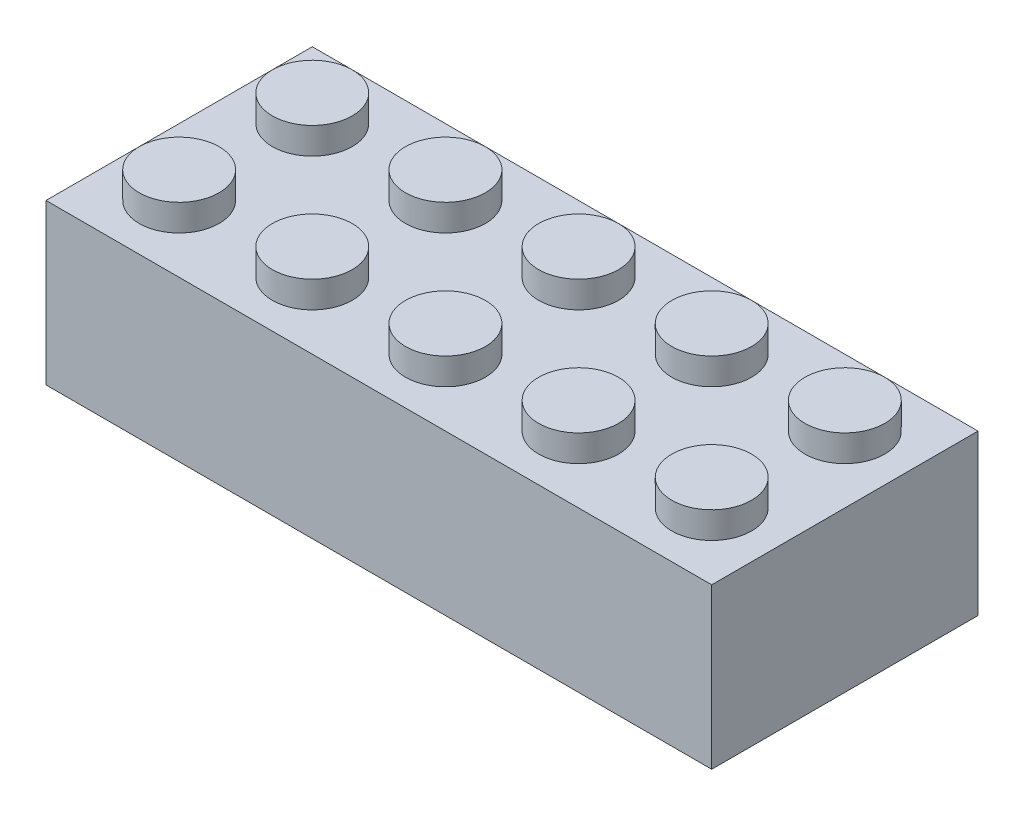
ISO-10303-21;
HEADER;
FILE_DESCRIPTION(('STEP AP214'),'2;1');
FILE_NAME('part.step','',(''),(''),'','','');
FILE_SCHEMA(('AUTOMOTIVE_DESIGN { 1 0 10303 214 1 1 1 1 }'));
ENDSEC;
DATA;
#1=APPLICATION_CONTEXT('core data for automotive mechanical design processes');
#2=APPLICATION_PROTOCOL_DEFINITION('international standard','automotive_design',2000,#1);
#3=PRODUCT_CONTEXT('',#1,'mechanical');
#4=PRODUCT('Part','Part','',(#3));
#5=PRODUCT_RELATED_PRODUCT_CATEGORY('part','',(#4));
#6=PRODUCT_DEFINITION_FORMATION('','',#4);
#7=PRODUCT_DEFINITION_CONTEXT('part definition',#1,'design');
#8=PRODUCT_DEFINITION('design','',#6,#7);
#9=PRODUCT_DEFINITION_SHAPE('','',#8);
#10=(LENGTH_UNIT() NAMED_UNIT(*) SI_UNIT(.MILLI.,.METRE.));
#11=(NAMED_UNIT(*) PLANE_ANGLE_UNIT() SI_UNIT($,.RADIAN.));
#12=(NAMED_UNIT(*) SI_UNIT($,.STERADIAN.) SOLID_ANGLE_UNIT());
#13=UNCERTAINTY_MEASURE_WITH_UNIT(LENGTH_MEASURE(1.E-05),#10,'distance_accuracy_value','');
#14=(GEOMETRIC_REPRESENTATION_CONTEXT(3) GLOBAL_UNCERTAINTY_ASSIGNED_CONTEXT((#13)) GLOBAL_UNIT_ASSIGNED_CONTEXT((#10,
#11,#12)) REPRESENTATION_CONTEXT('',''));
#15=CARTESIAN_POINT('',(0.,0.,0.));
#16=DIRECTION('',(0.,0.,1.));
#17=DIRECTION('',(1.,0.,0.));
#18=AXIS2_PLACEMENT_3D('',#15,#16,#17);
#19=CARTESIAN_POINT('',(36.,4.8,4.));
#20=DIRECTION('',(-1.,0.,0.));
#21=DIRECTION('',(0.,0.,1.));
#22=AXIS2_PLACEMENT_3D('',#19,#20,#21);
#23=PLANE('',#22);
#24=DIRECTION('',(0.,0.,-1.));
#25=VECTOR('',#24,1.);
#26=CARTESIAN_POINT('',(36.,0.,4.));
#27=LINE('',#26,#25);
#28=CARTESIAN_POINT('',(36.,0.,12.));
#29=VERTEX_POINT('',#28);
#30=CARTESIAN_POINT('',(36.,0.,-4.));
#31=VERTEX_POINT('',#30);
#32=EDGE_CURVE('E234',#29,#31,#27,.T.);
#33=ORIENTED_EDGE('',*,*,#32,.T.);
#34=DIRECTION('',(0.,-1.,0.));
#35=VECTOR('',#34,1.);
#36=CARTESIAN_POINT('',(36.,4.8,-4.));
#37=LINE('',#36,#35);
#38=CARTESIAN_POINT('',(36.,9.6,-4.));
#39=VERTEX_POINT('',#38);
#40=EDGE_CURVE('E252',#39,#31,#37,.T.);
#41=ORIENTED_EDGE('',*,*,#40,.F.);
#42=DIRECTION('',(0.,0.,-1.));
#43=VECTOR('',#42,1.);
#44=CARTESIAN_POINT('',(36.,9.6,4.));
#45=LINE('',#44,#43);
#46=CARTESIAN_POINT('',(36.,9.6,12.));
#47=VERTEX_POINT('',#46);
#48=EDGE_CURVE('E9',#47,#39,#45,.T.);
#49=ORIENTED_EDGE('',*,*,#48,.F.);
#50=DIRECTION('',(0.,1.,0.));
#51=VECTOR('',#50,1.);
#52=CARTESIAN_POINT('',(36.,4.8,12.));
#53=LINE('',#52,#51);
#54=EDGE_CURVE('E244',#29,#47,#53,.T.);
#55=ORIENTED_EDGE('',*,*,#54,.F.);
#56=EDGE_LOOP('',(#33,#41,#49,#55));
#57=FACE_BOUND('',#56,.T.);
#58=ADVANCED_FACE('F15',(#57),#23,.F.);
#59=CARTESIAN_POINT('',(16.,9.6,4.));
#60=DIRECTION('',(0.,-1.,0.));
#61=DIRECTION('',(0.,0.,-1.));
#62=AXIS2_PLACEMENT_3D('',#59,#60,#61);
#63=PLANE('',#62);
#64=ORIENTED_EDGE('',*,*,#48,.T.);
#65=DIRECTION('',(1.,0.,0.));
#66=VECTOR('',#65,1.);
#67=CARTESIAN_POINT('',(16.,9.6,-4.));
#68=LINE('',#67,#66);
#69=CARTESIAN_POINT('',(-4.,9.6,-4.));
#70=VERTEX_POINT('',#69);
#71=EDGE_CURVE('E242',#70,#39,#68,.T.);
#72=ORIENTED_EDGE('',*,*,#71,.F.);
#73=DIRECTION('',(0.,0.,-1.));
#74=VECTOR('',#73,1.);
#75=CARTESIAN_POINT('',(-4.,9.6,4.));
#76=LINE('',#75,#74);
#77=CARTESIAN_POINT('',(-4.,9.6,12.));
#78=VERTEX_POINT('',#77);
#79=EDGE_CURVE('E25',#78,#70,#76,.T.);
#80=ORIENTED_EDGE('',*,*,#79,.F.);
#81=DIRECTION('',(-1.,0.,0.));
#82=VECTOR('',#81,1.);
#83=CARTESIAN_POINT('',(16.,9.6,12.));
#84=LINE('',#83,#82);
#85=EDGE_CURVE('E247',#47,#78,#84,.T.);
#86=ORIENTED_EDGE('',*,*,#85,.F.);
#87=EDGE_LOOP('',(#64,#72,#80,#86));
#88=FACE_BOUND('',#87,.T.);
#89=CARTESIAN_POINT('',(0.,9.6,0.));
#90=DIRECTION('',(0.,-1.,0.));
#91=DIRECTION('',(1.,0.,0.));
#92=AXIS2_PLACEMENT_3D('',#89,#90,#91);
#93=CIRCLE('',#92,2.4);
#94=CARTESIAN_POINT('',(-2.4,9.6,0.));
#95=VERTEX_POINT('',#94);
#96=EDGE_CURVE('E248',#95,#95,#93,.T.);
#97=ORIENTED_EDGE('',*,*,#96,.T.);
#98=EDGE_LOOP('',(#97));
#99=FACE_BOUND('',#98,.T.);
#100=CARTESIAN_POINT('',(0.,9.6,8.));
#101=DIRECTION('',(0.,-1.,0.));
#102=DIRECTION('',(1.,0.,0.));
#103=AXIS2_PLACEMENT_3D('',#100,#101,#102);
#104=CIRCLE('',#103,2.4);
#105=CARTESIAN_POINT('',(-2.4,9.6,8.));
#106=VERTEX_POINT('',#105);
#107=EDGE_CURVE('E270',#106,#106,#104,.T.);
#108=ORIENTED_EDGE('',*,*,#107,.T.);
#109=EDGE_LOOP('',(#108));
#110=FACE_BOUND('',#109,.T.);
#111=CARTESIAN_POINT('',(8.,9.6,0.));
#112=DIRECTION('',(0.,-1.,0.));
#113=DIRECTION('',(1.,0.,0.));
#114=AXIS2_PLACEMENT_3D('',#111,#112,#113);
#115=CIRCLE('',#114,2.4);
#116=CARTESIAN_POINT('',(5.6,9.6,0.));
#117=VERTEX_POINT('',#116);
#118=EDGE_CURVE('E235',#117,#117,#115,.T.);
#119=ORIENTED_EDGE('',*,*,#118,.T.);
#120=EDGE_LOOP('',(#119));
#121=FACE_BOUND('',#120,.T.);
#122=CARTESIAN_POINT('',(8.,9.6,8.));
#123=DIRECTION('',(0.,-1.,0.));
#124=DIRECTION('',(1.,0.,0.));
#125=AXIS2_PLACEMENT_3D('',#122,#123,#124);
#126=CIRCLE('',#125,2.4);
#127=CARTESIAN_POINT('',(5.6,9.6,8.));
#128=VERTEX_POINT('',#127);
#129=EDGE_CURVE('E259',#128,#128,#126,.T.);
#130=ORIENTED_EDGE('',*,*,#129,.T.);
#131=EDGE_LOOP('',(#130));
#132=FACE_BOUND('',#131,.T.);
#133=CARTESIAN_POINT('',(16.,9.6,0.));
#134=DIRECTION('',(0.,-1.,0.));
#135=DIRECTION('',(1.,0.,0.));
#136=AXIS2_PLACEMENT_3D('',#133,#134,#135);
#137=CIRCLE('',#136,2.4);
#138=CARTESIAN_POINT('',(13.6,9.6,0.));
#139=VERTEX_POINT('',#138);
#140=EDGE_CURVE('E418',#139,#139,#137,.T.);
#141=ORIENTED_EDGE('',*,*,#140,.T.);
#142=EDGE_LOOP('',(#141));
#143=FACE_BOUND('',#142,.T.);
#144=CARTESIAN_POINT('',(16.,9.6,8.));
#145=DIRECTION('',(0.,-1.,0.));
#146=DIRECTION('',(1.,0.,0.));
#147=AXIS2_PLACEMENT_3D('',#144,#145,#146);
#148=CIRCLE('',#147,2.4);
#149=CARTESIAN_POINT('',(13.6,9.6,8.));
#150=VERTEX_POINT('',#149);
#151=EDGE_CURVE('E283',#150,#150,#148,.T.);
#152=ORIENTED_EDGE('',*,*,#151,.T.);
#153=EDGE_LOOP('',(#152));
#154=FACE_BOUND('',#153,.T.);
#155=CARTESIAN_POINT('',(24.,9.6,0.));
#156=DIRECTION('',(0.,-1.,0.));
#157=DIRECTION('',(1.,0.,0.));
#158=AXIS2_PLACEMENT_3D('',#155,#156,#157);
#159=CIRCLE('',#158,2.4);
#160=CARTESIAN_POINT('',(21.6,9.6,0.));
#161=VERTEX_POINT('',#160);
#162=EDGE_CURVE('E278',#161,#161,#159,.T.);
#163=ORIENTED_EDGE('',*,*,#162,.T.);
#164=EDGE_LOOP('',(#163));
#165=FACE_BOUND('',#164,.T.);
#166=CARTESIAN_POINT('',(24.,9.6,8.));
#167=DIRECTION('',(0.,-1.,0.));
#168=DIRECTION('',(1.,0.,0.));
#169=AXIS2_PLACEMENT_3D('',#166,#167,#168);
#170=CIRCLE('',#169,2.4);
#171=CARTESIAN_POINT('',(21.6,9.6,8.));
#172=VERTEX_POINT('',#171);
#173=EDGE_CURVE('E57',#172,#172,#170,.T.);
#174=ORIENTED_EDGE('',*,*,#173,.T.);
#175=EDGE_LOOP('',(#174));
#176=FACE_BOUND('',#175,.T.);
#177=CARTESIAN_POINT('',(32.,9.6,0.));
#178=DIRECTION('',(0.,-1.,0.));
#179=DIRECTION('',(1.,0.,0.));
#180=AXIS2_PLACEMENT_3D('',#177,#178,#179);
#181=CIRCLE('',#180,2.4);
#182=CARTESIAN_POINT('',(29.6,9.6,0.));
#183=VERTEX_POINT('',#182);
#184=EDGE_CURVE('E268',#183,#183,#181,.T.);
#185=ORIENTED_EDGE('',*,*,#184,.T.);
#186=EDGE_LOOP('',(#185));
#187=FACE_BOUND('',#186,.T.);
#188=CARTESIAN_POINT('',(32.,9.6,8.));
#189=DIRECTION('',(0.,-1.,0.));
#190=DIRECTION('',(1.,0.,0.));
#191=AXIS2_PLACEMENT_3D('',#188,#189,#190);
#192=CIRCLE('',#191,2.4);
#193=CARTESIAN_POINT('',(29.6,9.6,8.));
#194=VERTEX_POINT('',#193);
#195=EDGE_CURVE('E295',#194,#194,#192,.T.);
#196=ORIENTED_EDGE('',*,*,#195,.T.);
#197=EDGE_LOOP('',(#196));
#198=FACE_BOUND('',#197,.T.);
#199=ADVANCED_FACE('F322',(#88,#99,#110,#121,#132,#143,#154,#165,#176,#187,#198),#63,.F.);
#200=CARTESIAN_POINT('',(-4.,4.8,4.));
#201=DIRECTION('',(1.,0.,0.));
#202=DIRECTION('',(0.,0.,-1.));
#203=AXIS2_PLACEMENT_3D('',#200,#201,#202);
#204=PLANE('',#203);
#205=ORIENTED_EDGE('',*,*,#79,.T.);
#206=DIRECTION('',(0.,1.,0.));
#207=VECTOR('',#206,1.);
#208=CARTESIAN_POINT('',(-4.,4.8,-4.));
#209=LINE('',#208,#207);
#210=CARTESIAN_POINT('',(-4.,0.,-4.));
#211=VERTEX_POINT('',#210);
#212=EDGE_CURVE('E239',#211,#70,#209,.T.);
#213=ORIENTED_EDGE('',*,*,#212,.F.);
#214=DIRECTION('',(0.,0.,-1.));
#215=VECTOR('',#214,1.);
#216=CARTESIAN_POINT('',(-4.,0.,4.));
#217=LINE('',#216,#215);
#218=CARTESIAN_POINT('',(-4.,0.,12.));
#219=VERTEX_POINT('',#218);
#220=EDGE_CURVE('E301',#219,#211,#217,.T.);
#221=ORIENTED_EDGE('',*,*,#220,.F.);
#222=DIRECTION('',(0.,-1.,0.));
#223=VECTOR('',#222,1.);
#224=CARTESIAN_POINT('',(-4.,4.8,12.));
#225=LINE('',#224,#223);
#226=EDGE_CURVE('E253',#78,#219,#225,.T.);
#227=ORIENTED_EDGE('',*,*,#226,.F.);
#228=EDGE_LOOP('',(#205,#213,#221,#227));
#229=FACE_BOUND('',#228,.T.);
#230=ADVANCED_FACE('F349',(#229),#204,.F.);
#231=CARTESIAN_POINT('',(16.,0.,4.));
#232=DIRECTION('',(0.,1.,0.));
#233=DIRECTION('',(0.,0.,1.));
#234=AXIS2_PLACEMENT_3D('',#231,#232,#233);
#235=PLANE('',#234);
#236=ORIENTED_EDGE('',*,*,#220,.T.);
#237=DIRECTION('',(-1.,0.,0.));
#238=VECTOR('',#237,1.);
#239=CARTESIAN_POINT('',(16.,0.,-4.));
#240=LINE('',#239,#238);
#241=EDGE_CURVE('E243',#31,#211,#240,.T.);
#242=ORIENTED_EDGE('',*,*,#241,.F.);
#243=ORIENTED_EDGE('',*,*,#32,.F.);
#244=DIRECTION('',(1.,0.,0.));
#245=VECTOR('',#244,1.);
#246=CARTESIAN_POINT('',(16.,0.,12.));
#247=LINE('',#246,#245);
#248=EDGE_CURVE('E249',#219,#29,#247,.T.);
#249=ORIENTED_EDGE('',*,*,#248,.F.);
#250=EDGE_LOOP('',(#236,#242,#243,#249));
#251=FACE_BOUND('',#250,.T.);
#252=CARTESIAN_POINT('',(0.,0.,0.));
#253=DIRECTION('',(0.,1.,0.));
#254=DIRECTION('',(1.,0.,0.));
#255=AXIS2_PLACEMENT_3D('',#252,#253,#254);
#256=CIRCLE('',#255,2.4);
#257=CARTESIAN_POINT('',(-2.4,0.,0.));
#258=VERTEX_POINT('',#257);
#259=EDGE_CURVE('E276',#258,#258,#256,.T.);
#260=ORIENTED_EDGE('',*,*,#259,.T.);
#261=EDGE_LOOP('',(#260));
#262=FACE_BOUND('',#261,.T.);
#263=CARTESIAN_POINT('',(0.,0.,8.));
#264=DIRECTION('',(0.,1.,0.));
#265=DIRECTION('',(1.,0.,0.));
#266=AXIS2_PLACEMENT_3D('',#263,#264,#265);
#267=CIRCLE('',#266,2.4);
#268=CARTESIAN_POINT('',(-2.4,0.,8.));
#269=VERTEX_POINT('',#268);
#270=EDGE_CURVE('E277',#269,#269,#267,.T.);
#271=ORIENTED_EDGE('',*,*,#270,.T.);
#272=EDGE_LOOP('',(#271));
#273=FACE_BOUND('',#272,.T.);
#274=CARTESIAN_POINT('',(8.,0.,0.));
#275=DIRECTION('',(0.,1.,0.));
#276=DIRECTION('',(1.,0.,0.));
#277=AXIS2_PLACEMENT_3D('',#274,#275,#276);
#278=CIRCLE('',#277,2.4);
#279=CARTESIAN_POINT('',(5.6,0.,0.));
#280=VERTEX_POINT('',#279);
#281=EDGE_CURVE('E265',#280,#280,#278,.T.);
#282=ORIENTED_EDGE('',*,*,#281,.T.);
#283=EDGE_LOOP('',(#282));
#284=FACE_BOUND('',#283,.T.);
#285=CARTESIAN_POINT('',(8.,0.,8.));
#286=DIRECTION('',(0.,1.,0.));
#287=DIRECTION('',(1.,0.,0.));
#288=AXIS2_PLACEMENT_3D('',#285,#286,#287);
#289=CIRCLE('',#288,2.4);
#290=CARTESIAN_POINT('',(5.6,0.,8.));
#291=VERTEX_POINT('',#290);
#292=EDGE_CURVE('E266',#291,#291,#289,.T.);
#293=ORIENTED_EDGE('',*,*,#292,.T.);
#294=EDGE_LOOP('',(#293));
#295=FACE_BOUND('',#294,.T.);
#296=CARTESIAN_POINT('',(16.,0.,0.));
#297=DIRECTION('',(0.,1.,0.));
#298=DIRECTION('',(1.,0.,0.));
#299=AXIS2_PLACEMENT_3D('',#296,#297,#298);
#300=CIRCLE('',#299,2.4);
#301=CARTESIAN_POINT('',(13.6,0.,0.));
#302=VERTEX_POINT('',#301);
#303=EDGE_CURVE('E187',#302,#302,#300,.T.);
#304=ORIENTED_EDGE('',*,*,#303,.T.);
#305=EDGE_LOOP('',(#304));
#306=FACE_BOUND('',#305,.T.);
#307=CARTESIAN_POINT('',(16.,0.,8.));
#308=DIRECTION('',(0.,1.,0.));
#309=DIRECTION('',(1.,0.,0.));
#310=AXIS2_PLACEMENT_3D('',#307,#308,#309);
#311=CIRCLE('',#310,2.4);
#312=CARTESIAN_POINT('',(13.6,0.,8.));
#313=VERTEX_POINT('',#312);
#314=EDGE_CURVE('E124',#313,#313,#311,.T.);
#315=ORIENTED_EDGE('',*,*,#314,.T.);
#316=EDGE_LOOP('',(#315));
#317=FACE_BOUND('',#316,.T.);
#318=CARTESIAN_POINT('',(24.,0.,0.));
#319=DIRECTION('',(0.,1.,0.));
#320=DIRECTION('',(1.,0.,0.));
#321=AXIS2_PLACEMENT_3D('',#318,#319,#320);
#322=CIRCLE('',#321,2.4);
#323=CARTESIAN_POINT('',(21.6,0.,0.));
#324=VERTEX_POINT('',#323);
#325=EDGE_CURVE('E257',#324,#324,#322,.T.);
#326=ORIENTED_EDGE('',*,*,#325,.T.);
#327=EDGE_LOOP('',(#326));
#328=FACE_BOUND('',#327,.T.);
#329=CARTESIAN_POINT('',(24.,0.,8.));
#330=DIRECTION('',(0.,1.,0.));
#331=DIRECTION('',(1.,0.,0.));
#332=AXIS2_PLACEMENT_3D('',#329,#330,#331);
#333=CIRCLE('',#332,2.4);
#334=CARTESIAN_POINT('',(21.6,0.,8.));
#335=VERTEX_POINT('',#334);
#336=EDGE_CURVE('E220',#335,#335,#333,.T.);
#337=ORIENTED_EDGE('',*,*,#336,.T.);
#338=EDGE_LOOP('',(#337));
#339=FACE_BOUND('',#338,.T.);
#340=CARTESIAN_POINT('',(32.,0.,0.));
#341=DIRECTION('',(0.,1.,0.));
#342=DIRECTION('',(1.,0.,0.));
#343=AXIS2_PLACEMENT_3D('',#340,#341,#342);
#344=CIRCLE('',#343,2.4);
#345=CARTESIAN_POINT('',(29.6,0.,0.));
#346=VERTEX_POINT('',#345);
#347=EDGE_CURVE('E221',#346,#346,#344,.T.);
#348=ORIENTED_EDGE('',*,*,#347,.T.);
#349=EDGE_LOOP('',(#348));
#350=FACE_BOUND('',#349,.T.);
#351=CARTESIAN_POINT('',(32.,0.,8.));
#352=DIRECTION('',(0.,1.,0.));
#353=DIRECTION('',(1.,0.,0.));
#354=AXIS2_PLACEMENT_3D('',#351,#352,#353);
#355=CIRCLE('',#354,2.4);
#356=CARTESIAN_POINT('',(29.6,0.,8.));
#357=VERTEX_POINT('',#356);
#358=EDGE_CURVE('E304',#357,#357,#355,.T.);
#359=ORIENTED_EDGE('',*,*,#358,.T.);
#360=EDGE_LOOP('',(#359));
#361=FACE_BOUND('',#360,.T.);
#362=CARTESIAN_POINT('',(4.,0.,4.));
#363=DIRECTION('',(0.,1.,0.));
#364=DIRECTION('',(1.,0.,0.));
#365=AXIS2_PLACEMENT_3D('',#362,#363,#364);
#366=CIRCLE('',#365,2.4);
#367=CARTESIAN_POINT('',(1.6,0.,4.));
#368=VERTEX_POINT('',#367);
#369=EDGE_CURVE('E317',#368,#368,#366,.T.);
#370=ORIENTED_EDGE('',*,*,#369,.T.);
#371=EDGE_LOOP('',(#370));
#372=FACE_BOUND('',#371,.T.);
#373=CARTESIAN_POINT('',(12.,0.,4.));
#374=DIRECTION('',(0.,1.,0.));
#375=DIRECTION('',(1.,0.,0.));
#376=AXIS2_PLACEMENT_3D('',#373,#374,#375);
#377=CIRCLE('',#376,2.4);
#378=CARTESIAN_POINT('',(9.6,0.,4.));
#379=VERTEX_POINT('',#378);
#380=EDGE_CURVE('E106',#379,#379,#377,.T.);
#381=ORIENTED_EDGE('',*,*,#380,.T.);
#382=EDGE_LOOP('',(#381));
#383=FACE_BOUND('',#382,.T.);
#384=CARTESIAN_POINT('',(20.,0.,4.));
#385=DIRECTION('',(0.,1.,0.));
#386=DIRECTION('',(1.,0.,0.));
#387=AXIS2_PLACEMENT_3D('',#384,#385,#386);
#388=CIRCLE('',#387,2.4);
#389=CARTESIAN_POINT('',(17.6,0.,4.));
#390=VERTEX_POINT('',#389);
#391=EDGE_CURVE('E274',#390,#390,#388,.T.);
#392=ORIENTED_EDGE('',*,*,#391,.T.);
#393=EDGE_LOOP('',(#392));
#394=FACE_BOUND('',#393,.T.);
#395=CARTESIAN_POINT('',(28.,0.,4.));
#396=DIRECTION('',(0.,1.,0.));
#397=DIRECTION('',(1.,0.,0.));
#398=AXIS2_PLACEMENT_3D('',#395,#396,#397);
#399=CIRCLE('',#398,2.4);
#400=CARTESIAN_POINT('',(25.6,0.,4.));
#401=VERTEX_POINT('',#400);
#402=EDGE_CURVE('E428',#401,#401,#399,.T.);
#403=ORIENTED_EDGE('',*,*,#402,.T.);
#404=EDGE_LOOP('',(#403));
#405=FACE_BOUND('',#404,.T.);
#406=ADVANCED_FACE('F358',(#251,#262,#273,#284,#295,#306,#317,#328,#339,#350,#361,#372,#383,
#394,#405),#235,.F.);
#407=CARTESIAN_POINT('',(16.,4.8,-4.));
#408=DIRECTION('',(0.,0.,1.));
#409=DIRECTION('',(1.,0.,0.));
#410=AXIS2_PLACEMENT_3D('',#407,#408,#409);
#411=PLANE('',#410);
#412=ORIENTED_EDGE('',*,*,#40,.T.);
#413=ORIENTED_EDGE('',*,*,#241,.T.);
#414=ORIENTED_EDGE('',*,*,#212,.T.);
#415=ORIENTED_EDGE('',*,*,#71,.T.);
#416=EDGE_LOOP('',(#412,#413,#414,#415));
#417=FACE_BOUND('',#416,.T.);
#418=ADVANCED_FACE('F449',(#417),#411,.F.);
#419=CARTESIAN_POINT('',(16.,4.8,12.));
#420=DIRECTION('',(0.,0.,1.));
#421=DIRECTION('',(1.,0.,0.));
#422=AXIS2_PLACEMENT_3D('',#419,#420,#421);
#423=PLANE('',#422);
#424=ORIENTED_EDGE('',*,*,#54,.T.);
#425=ORIENTED_EDGE('',*,*,#85,.T.);
#426=ORIENTED_EDGE('',*,*,#226,.T.);
#427=ORIENTED_EDGE('',*,*,#248,.T.);
#428=EDGE_LOOP('',(#424,#425,#426,#427));
#429=FACE_BOUND('',#428,.T.);
#430=ADVANCED_FACE('F456',(#429),#423,.T.);
#431=CARTESIAN_POINT('',(0.,11.2,0.));
#432=DIRECTION('',(0.,1.,0.));
#433=DIRECTION('',(1.,0.,0.));
#434=AXIS2_PLACEMENT_3D('',#431,#432,#433);
#435=PLANE('',#434);
#436=CARTESIAN_POINT('',(0.,11.2,0.));
#437=DIRECTION('',(0.,1.,0.));
#438=DIRECTION('',(1.,0.,0.));
#439=AXIS2_PLACEMENT_3D('',#436,#437,#438);
#440=CIRCLE('',#439,2.4);
#441=CARTESIAN_POINT('',(2.4,11.2,0.));
#442=VERTEX_POINT('',#441);
#443=EDGE_CURVE('E272',#442,#442,#440,.T.);
#444=ORIENTED_EDGE('',*,*,#443,.T.);
#445=EDGE_LOOP('',(#444));
#446=FACE_BOUND('',#445,.T.);
#447=ADVANCED_FACE('F458',(#446),#435,.T.);
#448=CARTESIAN_POINT('',(0.,10.15,0.));
#449=DIRECTION('',(0.,-1.,0.));
#450=DIRECTION('',(1.,0.,0.));
#451=AXIS2_PLACEMENT_3D('',#448,#449,#450);
#452=CYLINDRICAL_SURFACE('',#451,2.4);
#453=ORIENTED_EDGE('',*,*,#96,.F.);
#454=EDGE_LOOP('',(#453));
#455=FACE_BOUND('',#454,.T.);
#456=ORIENTED_EDGE('',*,*,#443,.F.);
#457=EDGE_LOOP('',(#456));
#458=FACE_BOUND('',#457,.T.);
#459=ADVANCED_FACE('F464',(#455,#458),#452,.T.);
#460=CARTESIAN_POINT('',(0.,11.2,8.));
#461=DIRECTION('',(0.,1.,0.));
#462=DIRECTION('',(1.,0.,0.));
#463=AXIS2_PLACEMENT_3D('',#460,#461,#462);
#464=PLANE('',#463);
#465=CARTESIAN_POINT('',(0.,11.2,8.));
#466=DIRECTION('',(0.,1.,0.));
#467=DIRECTION('',(1.,0.,0.));
#468=AXIS2_PLACEMENT_3D('',#465,#466,#467);
#469=CIRCLE('',#468,2.4);
#470=CARTESIAN_POINT('',(2.4,11.2,8.));
#471=VERTEX_POINT('',#470);
#472=EDGE_CURVE('E237',#471,#471,#469,.T.);
#473=ORIENTED_EDGE('',*,*,#472,.T.);
#474=EDGE_LOOP('',(#473));
#475=FACE_BOUND('',#474,.T.);
#476=ADVANCED_FACE('F369',(#475),#464,.T.);
#477=CARTESIAN_POINT('',(0.,10.15,8.));
#478=DIRECTION('',(0.,-1.,0.));
#479=DIRECTION('',(1.,0.,0.));
#480=AXIS2_PLACEMENT_3D('',#477,#478,#479);
#481=CYLINDRICAL_SURFACE('',#480,2.4);
#482=ORIENTED_EDGE('',*,*,#107,.F.);
#483=EDGE_LOOP('',(#482));
#484=FACE_BOUND('',#483,.T.);
#485=ORIENTED_EDGE('',*,*,#472,.F.);
#486=EDGE_LOOP('',(#485));
#487=FACE_BOUND('',#486,.T.);
#488=ADVANCED_FACE('F365',(#484,#487),#481,.T.);
#489=CARTESIAN_POINT('',(8.,11.2,0.));
#490=DIRECTION('',(0.,1.,0.));
#491=DIRECTION('',(1.,0.,0.));
#492=AXIS2_PLACEMENT_3D('',#489,#490,#491);
#493=PLANE('',#492);
#494=CARTESIAN_POINT('',(8.,11.2,0.));
#495=DIRECTION('',(0.,1.,0.));
#496=DIRECTION('',(1.,0.,0.));
#497=AXIS2_PLACEMENT_3D('',#494,#495,#496);
#498=CIRCLE('',#497,2.4);
#499=CARTESIAN_POINT('',(10.4,11.2,0.));
#500=VERTEX_POINT('',#499);
#501=EDGE_CURVE('E238',#500,#500,#498,.T.);
#502=ORIENTED_EDGE('',*,*,#501,.T.);
#503=EDGE_LOOP('',(#502));
#504=FACE_BOUND('',#503,.T.);
#505=ADVANCED_FACE('F368',(#504),#493,.T.);
#506=CARTESIAN_POINT('',(8.,10.15,0.));
#507=DIRECTION('',(0.,-1.,0.));
#508=DIRECTION('',(1.,0.,0.));
#509=AXIS2_PLACEMENT_3D('',#506,#507,#508);
#510=CYLINDRICAL_SURFACE('',#509,2.4);
#511=ORIENTED_EDGE('',*,*,#118,.F.);
#512=EDGE_LOOP('',(#511));
#513=FACE_BOUND('',#512,.T.);
#514=ORIENTED_EDGE('',*,*,#501,.F.);
#515=EDGE_LOOP('',(#514));
#516=FACE_BOUND('',#515,.T.);
#517=ADVANCED_FACE('F412',(#513,#516),#510,.T.);
#518=CARTESIAN_POINT('',(8.,11.2,8.));
#519=DIRECTION('',(0.,1.,0.));
#520=DIRECTION('',(1.,0.,0.));
#521=AXIS2_PLACEMENT_3D('',#518,#519,#520);
#522=PLANE('',#521);
#523=CARTESIAN_POINT('',(8.,11.2,8.));
#524=DIRECTION('',(0.,1.,0.));
#525=DIRECTION('',(1.,0.,0.));
#526=AXIS2_PLACEMENT_3D('',#523,#524,#525);
#527=CIRCLE('',#526,2.4);
#528=CARTESIAN_POINT('',(10.4,11.2,8.));
#529=VERTEX_POINT('',#528);
#530=EDGE_CURVE('E261',#529,#529,#527,.T.);
#531=ORIENTED_EDGE('',*,*,#530,.T.);
#532=EDGE_LOOP('',(#531));
#533=FACE_BOUND('',#532,.T.);
#534=ADVANCED_FACE('F405',(#533),#522,.T.);
#535=CARTESIAN_POINT('',(8.,10.15,8.));
#536=DIRECTION('',(0.,-1.,0.));
#537=DIRECTION('',(1.,0.,0.));
#538=AXIS2_PLACEMENT_3D('',#535,#536,#537);
#539=CYLINDRICAL_SURFACE('',#538,2.4);
#540=ORIENTED_EDGE('',*,*,#129,.F.);
#541=EDGE_LOOP('',(#540));
#542=FACE_BOUND('',#541,.T.);
#543=ORIENTED_EDGE('',*,*,#530,.F.);
#544=EDGE_LOOP('',(#543));
#545=FACE_BOUND('',#544,.T.);
#546=ADVANCED_FACE('F403',(#542,#545),#539,.T.);
#547=CARTESIAN_POINT('',(16.,11.2,0.));
#548=DIRECTION('',(0.,1.,0.));
#549=DIRECTION('',(1.,0.,0.));
#550=AXIS2_PLACEMENT_3D('',#547,#548,#549);
#551=PLANE('',#550);
#552=CARTESIAN_POINT('',(16.,11.2,0.));
#553=DIRECTION('',(0.,1.,0.));
#554=DIRECTION('',(1.,0.,0.));
#555=AXIS2_PLACEMENT_3D('',#552,#553,#554);
#556=CIRCLE('',#555,2.4);
#557=CARTESIAN_POINT('',(18.4,11.2,0.));
#558=VERTEX_POINT('',#557);
#559=EDGE_CURVE('E306',#558,#558,#556,.T.);
#560=ORIENTED_EDGE('',*,*,#559,.T.);
#561=EDGE_LOOP('',(#560));
#562=FACE_BOUND('',#561,.T.);
#563=ADVANCED_FACE('F354',(#562),#551,.T.);
#564=CARTESIAN_POINT('',(16.,10.15,0.));
#565=DIRECTION('',(0.,-1.,0.));
#566=DIRECTION('',(1.,0.,0.));
#567=AXIS2_PLACEMENT_3D('',#564,#565,#566);
#568=CYLINDRICAL_SURFACE('',#567,2.4);
#569=ORIENTED_EDGE('',*,*,#140,.F.);
#570=EDGE_LOOP('',(#569));
#571=FACE_BOUND('',#570,.T.);
#572=ORIENTED_EDGE('',*,*,#559,.F.);
#573=EDGE_LOOP('',(#572));
#574=FACE_BOUND('',#573,.T.);
#575=ADVANCED_FACE('F395',(#571,#574),#568,.T.);
#576=CARTESIAN_POINT('',(16.,11.2,8.));
#577=DIRECTION('',(0.,1.,0.));
#578=DIRECTION('',(1.,0.,0.));
#579=AXIS2_PLACEMENT_3D('',#576,#577,#578);
#580=PLANE('',#579);
#581=CARTESIAN_POINT('',(16.,11.2,8.));
#582=DIRECTION('',(0.,1.,0.));
#583=DIRECTION('',(1.,0.,0.));
#584=AXIS2_PLACEMENT_3D('',#581,#582,#583);
#585=CIRCLE('',#584,2.4);
#586=CARTESIAN_POINT('',(18.4,11.2,8.));
#587=VERTEX_POINT('',#586);
#588=EDGE_CURVE('E279',#587,#587,#585,.T.);
#589=ORIENTED_EDGE('',*,*,#588,.T.);
#590=EDGE_LOOP('',(#589));
#591=FACE_BOUND('',#590,.T.);
#592=ADVANCED_FACE('F391',(#591),#580,.T.);
#593=CARTESIAN_POINT('',(16.,10.15,8.));
#594=DIRECTION('',(0.,-1.,0.));
#595=DIRECTION('',(1.,0.,0.));
#596=AXIS2_PLACEMENT_3D('',#593,#594,#595);
#597=CYLINDRICAL_SURFACE('',#596,2.4);
#598=ORIENTED_EDGE('',*,*,#151,.F.);
#599=EDGE_LOOP('',(#598));
#600=FACE_BOUND('',#599,.T.);
#601=ORIENTED_EDGE('',*,*,#588,.F.);
#602=EDGE_LOOP('',(#601));
#603=FACE_BOUND('',#602,.T.);
#604=ADVANCED_FACE('F394',(#600,#603),#597,.T.);
#605=CARTESIAN_POINT('',(24.,11.2,0.));
#606=DIRECTION('',(0.,1.,0.));
#607=DIRECTION('',(1.,0.,0.));
#608=AXIS2_PLACEMENT_3D('',#605,#606,#607);
#609=PLANE('',#608);
#610=CARTESIAN_POINT('',(24.,11.2,0.));
#611=DIRECTION('',(0.,1.,0.));
#612=DIRECTION('',(1.,0.,0.));
#613=AXIS2_PLACEMENT_3D('',#610,#611,#612);
#614=CIRCLE('',#613,2.4);
#615=CARTESIAN_POINT('',(26.4,11.2,0.));
#616=VERTEX_POINT('',#615);
#617=EDGE_CURVE('E280',#616,#616,#614,.T.);
#618=ORIENTED_EDGE('',*,*,#617,.T.);
#619=EDGE_LOOP('',(#618));
#620=FACE_BOUND('',#619,.T.);
#621=ADVANCED_FACE('F484',(#620),#609,.T.);
#622=CARTESIAN_POINT('',(24.,10.15,0.));
#623=DIRECTION('',(0.,-1.,0.));
#624=DIRECTION('',(1.,0.,0.));
#625=AXIS2_PLACEMENT_3D('',#622,#623,#624);
#626=CYLINDRICAL_SURFACE('',#625,2.4);
#627=ORIENTED_EDGE('',*,*,#162,.F.);
#628=EDGE_LOOP('',(#627));
#629=FACE_BOUND('',#628,.T.);
#630=ORIENTED_EDGE('',*,*,#617,.F.);
#631=EDGE_LOOP('',(#630));
#632=FACE_BOUND('',#631,.T.);
#633=ADVANCED_FACE('F481',(#629,#632),#626,.T.);
#634=CARTESIAN_POINT('',(24.,11.2,8.));
#635=DIRECTION('',(0.,1.,0.));
#636=DIRECTION('',(1.,0.,0.));
#637=AXIS2_PLACEMENT_3D('',#634,#635,#636);
#638=PLANE('',#637);
#639=CARTESIAN_POINT('',(24.,11.2,8.));
#640=DIRECTION('',(0.,1.,0.));
#641=DIRECTION('',(1.,0.,0.));
#642=AXIS2_PLACEMENT_3D('',#639,#640,#641);
#643=CIRCLE('',#642,2.4);
#644=CARTESIAN_POINT('',(26.4,11.2,8.));
#645=VERTEX_POINT('',#644);
#646=EDGE_CURVE('E66',#645,#645,#643,.T.);
#647=ORIENTED_EDGE('',*,*,#646,.T.);
#648=EDGE_LOOP('',(#647));
#649=FACE_BOUND('',#648,.T.);
#650=ADVANCED_FACE('F17',(#649),#638,.T.);
#651=CARTESIAN_POINT('',(24.,10.15,8.));
#652=DIRECTION('',(0.,-1.,0.));
#653=DIRECTION('',(1.,0.,0.));
#654=AXIS2_PLACEMENT_3D('',#651,#652,#653);
#655=CYLINDRICAL_SURFACE('',#654,2.4);
#656=ORIENTED_EDGE('',*,*,#173,.F.);
#657=EDGE_LOOP('',(#656));
#658=FACE_BOUND('',#657,.T.);
#659=ORIENTED_EDGE('',*,*,#646,.F.);
#660=EDGE_LOOP('',(#659));
#661=FACE_BOUND('',#660,.T.);
#662=ADVANCED_FACE('F763',(#658,#661),#655,.T.);
#663=CARTESIAN_POINT('',(32.,11.2,0.));
#664=DIRECTION('',(0.,1.,0.));
#665=DIRECTION('',(1.,0.,0.));
#666=AXIS2_PLACEMENT_3D('',#663,#664,#665);
#667=PLANE('',#666);
#668=CARTESIAN_POINT('',(32.,11.2,0.));
#669=DIRECTION('',(0.,1.,0.));
#670=DIRECTION('',(1.,0.,0.));
#671=AXIS2_PLACEMENT_3D('',#668,#669,#670);
#672=CIRCLE('',#671,2.4);
#673=CARTESIAN_POINT('',(34.4,11.2,0.));
#674=VERTEX_POINT('',#673);
#675=EDGE_CURVE('E298',#674,#674,#672,.T.);
#676=ORIENTED_EDGE('',*,*,#675,.T.);
#677=EDGE_LOOP('',(#676));
#678=FACE_BOUND('',#677,.T.);
#679=ADVANCED_FACE('F339',(#678),#667,.T.);
#680=CARTESIAN_POINT('',(32.,10.15,0.));
#681=DIRECTION('',(0.,-1.,0.));
#682=DIRECTION('',(1.,0.,0.));
#683=AXIS2_PLACEMENT_3D('',#680,#681,#682);
#684=CYLINDRICAL_SURFACE('',#683,2.4);
#685=ORIENTED_EDGE('',*,*,#184,.F.);
#686=EDGE_LOOP('',(#685));
#687=FACE_BOUND('',#686,.T.);
#688=ORIENTED_EDGE('',*,*,#675,.F.);
#689=EDGE_LOOP('',(#688));
#690=FACE_BOUND('',#689,.T.);
#691=ADVANCED_FACE('F333',(#687,#690),#684,.T.);
#692=CARTESIAN_POINT('',(32.,11.2,8.));
#693=DIRECTION('',(0.,1.,0.));
#694=DIRECTION('',(1.,0.,0.));
#695=AXIS2_PLACEMENT_3D('',#692,#693,#694);
#696=PLANE('',#695);
#697=CARTESIAN_POINT('',(32.,11.2,8.));
#698=DIRECTION('',(0.,1.,0.));
#699=DIRECTION('',(1.,0.,0.));
#700=AXIS2_PLACEMENT_3D('',#697,#698,#699);
#701=CIRCLE('',#700,2.4);
#702=CARTESIAN_POINT('',(34.4,11.2,8.));
#703=VERTEX_POINT('',#702);
#704=EDGE_CURVE('E293',#703,#703,#701,.T.);
#705=ORIENTED_EDGE('',*,*,#704,.T.);
#706=EDGE_LOOP('',(#705));
#707=FACE_BOUND('',#706,.T.);
#708=ADVANCED_FACE('F328',(#707),#696,.T.);
#709=CARTESIAN_POINT('',(32.,10.15,8.));
#710=DIRECTION('',(0.,-1.,0.));
#711=DIRECTION('',(1.,0.,0.));
#712=AXIS2_PLACEMENT_3D('',#709,#710,#711);
#713=CYLINDRICAL_SURFACE('',#712,2.4);
#714=ORIENTED_EDGE('',*,*,#195,.F.);
#715=EDGE_LOOP('',(#714));
#716=FACE_BOUND('',#715,.T.);
#717=ORIENTED_EDGE('',*,*,#704,.F.);
#718=EDGE_LOOP('',(#717));
#719=FACE_BOUND('',#718,.T.);
#720=ADVANCED_FACE('F324',(#716,#719),#713,.T.);
#721=CARTESIAN_POINT('',(0.,1.6,0.));
#722=DIRECTION('',(0.,1.,0.));
#723=DIRECTION('',(1.,0.,0.));
#724=AXIS2_PLACEMENT_3D('',#721,#722,#723);
#725=PLANE('',#724);
#726=CARTESIAN_POINT('',(0.,1.6,0.));
#727=DIRECTION('',(0.,1.,0.));
#728=DIRECTION('',(1.,0.,0.));
#729=AXIS2_PLACEMENT_3D('',#726,#727,#728);
#730=CIRCLE('',#729,2.4);
#731=CARTESIAN_POINT('',(2.4,1.6,0.));
#732=VERTEX_POINT('',#731);
#733=EDGE_CURVE('E296',#732,#732,#730,.T.);
#734=ORIENTED_EDGE('',*,*,#733,.F.);
#735=EDGE_LOOP('',(#734));
#736=FACE_BOUND('',#735,.T.);
#737=ADVANCED_FACE('F327',(#736),#725,.F.);
#738=CARTESIAN_POINT('',(0.,0.55,0.));
#739=DIRECTION('',(0.,-1.,0.));
#740=DIRECTION('',(1.,0.,0.));
#741=AXIS2_PLACEMENT_3D('',#738,#739,#740);
#742=CYLINDRICAL_SURFACE('',#741,2.4);
#743=ORIENTED_EDGE('',*,*,#733,.T.);
#744=EDGE_LOOP('',(#743));
#745=FACE_BOUND('',#744,.T.);
#746=ORIENTED_EDGE('',*,*,#259,.F.);
#747=EDGE_LOOP('',(#746));
#748=FACE_BOUND('',#747,.T.);
#749=ADVANCED_FACE('F504',(#745,#748),#742,.F.);
#750=CARTESIAN_POINT('',(0.,1.6,8.));
#751=DIRECTION('',(0.,1.,0.));
#752=DIRECTION('',(1.,0.,0.));
#753=AXIS2_PLACEMENT_3D('',#750,#751,#752);
#754=PLANE('',#753);
#755=CARTESIAN_POINT('',(0.,1.6,8.));
#756=DIRECTION('',(0.,1.,0.));
#757=DIRECTION('',(1.,0.,0.));
#758=AXIS2_PLACEMENT_3D('',#755,#756,#757);
#759=CIRCLE('',#758,2.4);
#760=CARTESIAN_POINT('',(2.4,1.6,8.));
#761=VERTEX_POINT('',#760);
#762=EDGE_CURVE('E275',#761,#761,#759,.T.);
#763=ORIENTED_EDGE('',*,*,#762,.F.);
#764=EDGE_LOOP('',(#763));
#765=FACE_BOUND('',#764,.T.);
#766=ADVANCED_FACE('F501',(#765),#754,.F.);
#767=CARTESIAN_POINT('',(0.,0.55,8.));
#768=DIRECTION('',(0.,-1.,0.));
#769=DIRECTION('',(1.,0.,0.));
#770=AXIS2_PLACEMENT_3D('',#767,#768,#769);
#771=CYLINDRICAL_SURFACE('',#770,2.4);
#772=ORIENTED_EDGE('',*,*,#762,.T.);
#773=EDGE_LOOP('',(#772));
#774=FACE_BOUND('',#773,.T.);
#775=ORIENTED_EDGE('',*,*,#270,.F.);
#776=EDGE_LOOP('',(#775));
#777=FACE_BOUND('',#776,.T.);
#778=ADVANCED_FACE('F497',(#774,#777),#771,.F.);
#779=CARTESIAN_POINT('',(8.,1.6,0.));
#780=DIRECTION('',(0.,1.,0.));
#781=DIRECTION('',(1.,0.,0.));
#782=AXIS2_PLACEMENT_3D('',#779,#780,#781);
#783=PLANE('',#782);
#784=CARTESIAN_POINT('',(8.,1.6,0.));
#785=DIRECTION('',(0.,1.,0.));
#786=DIRECTION('',(1.,0.,0.));
#787=AXIS2_PLACEMENT_3D('',#784,#785,#786);
#788=CIRCLE('',#787,2.4);
#789=CARTESIAN_POINT('',(10.4,1.6,0.));
#790=VERTEX_POINT('',#789);
#791=EDGE_CURVE('E19',#790,#790,#788,.T.);
#792=ORIENTED_EDGE('',*,*,#791,.F.);
#793=EDGE_LOOP('',(#792));
#794=FACE_BOUND('',#793,.T.);
#795=ADVANCED_FACE('F500',(#794),#783,.F.);
#796=CARTESIAN_POINT('',(8.,0.55,0.));
#797=DIRECTION('',(0.,-1.,0.));
#798=DIRECTION('',(1.,0.,0.));
#799=AXIS2_PLACEMENT_3D('',#796,#797,#798);
#800=CYLINDRICAL_SURFACE('',#799,2.4);
#801=ORIENTED_EDGE('',*,*,#791,.T.);
#802=EDGE_LOOP('',(#801));
#803=FACE_BOUND('',#802,.T.);
#804=ORIENTED_EDGE('',*,*,#281,.F.);
#805=EDGE_LOOP('',(#804));
#806=FACE_BOUND('',#805,.T.);
#807=ADVANCED_FACE('F507',(#803,#806),#800,.F.);
#808=CARTESIAN_POINT('',(8.,1.6,8.));
#809=DIRECTION('',(0.,1.,0.));
#810=DIRECTION('',(1.,0.,0.));
#811=AXIS2_PLACEMENT_3D('',#808,#809,#810);
#812=PLANE('',#811);
#813=CARTESIAN_POINT('',(8.,1.6,8.));
#814=DIRECTION('',(0.,1.,0.));
#815=DIRECTION('',(1.,0.,0.));
#816=AXIS2_PLACEMENT_3D('',#813,#814,#815);
#817=CIRCLE('',#816,2.4);
#818=CARTESIAN_POINT('',(10.4,1.6,8.));
#819=VERTEX_POINT('',#818);
#820=EDGE_CURVE('E263',#819,#819,#817,.T.);
#821=ORIENTED_EDGE('',*,*,#820,.F.);
#822=EDGE_LOOP('',(#821));
#823=FACE_BOUND('',#822,.T.);
#824=ADVANCED_FACE('F389',(#823),#812,.F.);
#825=CARTESIAN_POINT('',(8.,0.55,8.));
#826=DIRECTION('',(0.,-1.,0.));
#827=DIRECTION('',(1.,0.,0.));
#828=AXIS2_PLACEMENT_3D('',#825,#826,#827);
#829=CYLINDRICAL_SURFACE('',#828,2.4);
#830=ORIENTED_EDGE('',*,*,#820,.T.);
#831=EDGE_LOOP('',(#830));
#832=FACE_BOUND('',#831,.T.);
#833=ORIENTED_EDGE('',*,*,#292,.F.);
#834=EDGE_LOOP('',(#833));
#835=FACE_BOUND('',#834,.T.);
#836=ADVANCED_FACE('F385',(#832,#835),#829,.F.);
#837=CARTESIAN_POINT('',(16.,1.6,0.));
#838=DIRECTION('',(0.,1.,0.));
#839=DIRECTION('',(1.,0.,0.));
#840=AXIS2_PLACEMENT_3D('',#837,#838,#839);
#841=PLANE('',#840);
#842=CARTESIAN_POINT('',(16.,1.6,0.));
#843=DIRECTION('',(0.,1.,0.));
#844=DIRECTION('',(1.,0.,0.));
#845=AXIS2_PLACEMENT_3D('',#842,#843,#844);
#846=CIRCLE('',#845,2.4);
#847=CARTESIAN_POINT('',(18.4,1.6,0.));
#848=VERTEX_POINT('',#847);
#849=EDGE_CURVE('E192',#848,#848,#846,.T.);
#850=ORIENTED_EDGE('',*,*,#849,.F.);
#851=EDGE_LOOP('',(#850));
#852=FACE_BOUND('',#851,.T.);
#853=ADVANCED_FACE('F388',(#852),#841,.F.);
#854=CARTESIAN_POINT('',(16.,0.55,0.));
#855=DIRECTION('',(0.,-1.,0.));
#856=DIRECTION('',(1.,0.,0.));
#857=AXIS2_PLACEMENT_3D('',#854,#855,#856);
#858=CYLINDRICAL_SURFACE('',#857,2.4);
#859=ORIENTED_EDGE('',*,*,#849,.T.);
#860=EDGE_LOOP('',(#859));
#861=FACE_BOUND('',#860,.T.);
#862=ORIENTED_EDGE('',*,*,#303,.F.);
#863=EDGE_LOOP('',(#862));
#864=FACE_BOUND('',#863,.T.);
#865=ADVANCED_FACE('F397',(#861,#864),#858,.F.);
#866=CARTESIAN_POINT('',(16.,1.6,8.));
#867=DIRECTION('',(0.,1.,0.));
#868=DIRECTION('',(1.,0.,0.));
#869=AXIS2_PLACEMENT_3D('',#866,#867,#868);
#870=PLANE('',#869);
#871=CARTESIAN_POINT('',(16.,1.6,8.));
#872=DIRECTION('',(0.,1.,0.));
#873=DIRECTION('',(1.,0.,0.));
#874=AXIS2_PLACEMENT_3D('',#871,#872,#873);
#875=CIRCLE('',#874,2.4);
#876=CARTESIAN_POINT('',(18.4,1.6,8.));
#877=VERTEX_POINT('',#876);
#878=EDGE_CURVE('E231',#877,#877,#875,.T.);
#879=ORIENTED_EDGE('',*,*,#878,.F.);
#880=EDGE_LOOP('',(#879));
#881=FACE_BOUND('',#880,.T.);
#882=ADVANCED_FACE('F400',(#881),#870,.F.);
#883=CARTESIAN_POINT('',(16.,0.55,8.));
#884=DIRECTION('',(0.,-1.,0.));
#885=DIRECTION('',(1.,0.,0.));
#886=AXIS2_PLACEMENT_3D('',#883,#884,#885);
#887=CYLINDRICAL_SURFACE('',#886,2.4);
#888=ORIENTED_EDGE('',*,*,#878,.T.);
#889=EDGE_LOOP('',(#888));
#890=FACE_BOUND('',#889,.T.);
#891=ORIENTED_EDGE('',*,*,#314,.F.);
#892=EDGE_LOOP('',(#891));
#893=FACE_BOUND('',#892,.T.);
#894=ADVANCED_FACE('F375',(#890,#893),#887,.F.);
#895=CARTESIAN_POINT('',(24.,1.6,0.));
#896=DIRECTION('',(0.,1.,0.));
#897=DIRECTION('',(1.,0.,0.));
#898=AXIS2_PLACEMENT_3D('',#895,#896,#897);
#899=PLANE('',#898);
#900=CARTESIAN_POINT('',(24.,1.6,0.));
#901=DIRECTION('',(0.,1.,0.));
#902=DIRECTION('',(1.,0.,0.));
#903=AXIS2_PLACEMENT_3D('',#900,#901,#902);
#904=CIRCLE('',#903,2.4);
#905=CARTESIAN_POINT('',(26.4,1.6,0.));
#906=VERTEX_POINT('',#905);
#907=EDGE_CURVE('E132',#906,#906,#904,.T.);
#908=ORIENTED_EDGE('',*,*,#907,.F.);
#909=EDGE_LOOP('',(#908));
#910=FACE_BOUND('',#909,.T.);
#911=ADVANCED_FACE('F371',(#910),#899,.F.);
#912=CARTESIAN_POINT('',(24.,0.55,0.));
#913=DIRECTION('',(0.,-1.,0.));
#914=DIRECTION('',(1.,0.,0.));
#915=AXIS2_PLACEMENT_3D('',#912,#913,#914);
#916=CYLINDRICAL_SURFACE('',#915,2.4);
#917=ORIENTED_EDGE('',*,*,#907,.T.);
#918=EDGE_LOOP('',(#917));
#919=FACE_BOUND('',#918,.T.);
#920=ORIENTED_EDGE('',*,*,#325,.F.);
#921=EDGE_LOOP('',(#920));
#922=FACE_BOUND('',#921,.T.);
#923=ADVANCED_FACE('F374',(#919,#922),#916,.F.);
#924=CARTESIAN_POINT('',(24.,1.6,8.));
#925=DIRECTION('',(0.,1.,0.));
#926=DIRECTION('',(1.,0.,0.));
#927=AXIS2_PLACEMENT_3D('',#924,#925,#926);
#928=PLANE('',#927);
#929=CARTESIAN_POINT('',(24.,1.6,8.));
#930=DIRECTION('',(0.,1.,0.));
#931=DIRECTION('',(1.,0.,0.));
#932=AXIS2_PLACEMENT_3D('',#929,#930,#931);
#933=CIRCLE('',#932,2.4);
#934=CARTESIAN_POINT('',(26.4,1.6,8.));
#935=VERTEX_POINT('',#934);
#936=EDGE_CURVE('E223',#935,#935,#933,.T.);
#937=ORIENTED_EDGE('',*,*,#936,.F.);
#938=EDGE_LOOP('',(#937));
#939=FACE_BOUND('',#938,.T.);
#940=ADVANCED_FACE('F381',(#939),#928,.F.);
#941=CARTESIAN_POINT('',(24.,0.55,8.));
#942=DIRECTION('',(0.,-1.,0.));
#943=DIRECTION('',(1.,0.,0.));
#944=AXIS2_PLACEMENT_3D('',#941,#942,#943);
#945=CYLINDRICAL_SURFACE('',#944,2.4);
#946=ORIENTED_EDGE('',*,*,#936,.T.);
#947=EDGE_LOOP('',(#946));
#948=FACE_BOUND('',#947,.T.);
#949=ORIENTED_EDGE('',*,*,#336,.F.);
#950=EDGE_LOOP('',(#949));
#951=FACE_BOUND('',#950,.T.);
#952=ADVANCED_FACE('F377',(#948,#951),#945,.F.);
#953=CARTESIAN_POINT('',(32.,1.6,0.));
#954=DIRECTION('',(0.,1.,0.));
#955=DIRECTION('',(1.,0.,0.));
#956=AXIS2_PLACEMENT_3D('',#953,#954,#955);
#957=PLANE('',#956);
#958=CARTESIAN_POINT('',(32.,1.6,0.));
#959=DIRECTION('',(0.,1.,0.));
#960=DIRECTION('',(1.,0.,0.));
#961=AXIS2_PLACEMENT_3D('',#958,#959,#960);
#962=CIRCLE('',#961,2.4);
#963=CARTESIAN_POINT('',(34.4,1.6,0.));
#964=VERTEX_POINT('',#963);
#965=EDGE_CURVE('E216',#964,#964,#962,.T.);
#966=ORIENTED_EDGE('',*,*,#965,.F.);
#967=EDGE_LOOP('',(#966));
#968=FACE_BOUND('',#967,.T.);
#969=ADVANCED_FACE('F380',(#968),#957,.F.);
#970=CARTESIAN_POINT('',(32.,0.55,0.));
#971=DIRECTION('',(0.,-1.,0.));
#972=DIRECTION('',(1.,0.,0.));
#973=AXIS2_PLACEMENT_3D('',#970,#971,#972);
#974=CYLINDRICAL_SURFACE('',#973,2.4);
#975=ORIENTED_EDGE('',*,*,#965,.T.);
#976=EDGE_LOOP('',(#975));
#977=FACE_BOUND('',#976,.T.);
#978=ORIENTED_EDGE('',*,*,#347,.F.);
#979=EDGE_LOOP('',(#978));
#980=FACE_BOUND('',#979,.T.);
#981=ADVANCED_FACE('F217',(#977,#980),#974,.F.);
#982=CARTESIAN_POINT('',(32.,1.6,8.));
#983=DIRECTION('',(0.,1.,0.));
#984=DIRECTION('',(1.,0.,0.));
#985=AXIS2_PLACEMENT_3D('',#982,#983,#984);
#986=PLANE('',#985);
#987=CARTESIAN_POINT('',(32.,1.6,8.));
#988=DIRECTION('',(0.,1.,0.));
#989=DIRECTION('',(1.,0.,0.));
#990=AXIS2_PLACEMENT_3D('',#987,#988,#989);
#991=CIRCLE('',#990,2.4);
#992=CARTESIAN_POINT('',(34.4,1.6,8.));
#993=VERTEX_POINT('',#992);
#994=EDGE_CURVE('E225',#993,#993,#991,.T.);
#995=ORIENTED_EDGE('',*,*,#994,.F.);
#996=EDGE_LOOP('',(#995));
#997=FACE_BOUND('',#996,.T.);
#998=ADVANCED_FACE('F615',(#997),#986,.F.);
#999=CARTESIAN_POINT('',(32.,0.55,8.));
#1000=DIRECTION('',(0.,-1.,0.));
#1001=DIRECTION('',(1.,0.,0.));
#1002=AXIS2_PLACEMENT_3D('',#999,#1000,#1001);
#1003=CYLINDRICAL_SURFACE('',#1002,2.4);
#1004=ORIENTED_EDGE('',*,*,#994,.T.);
#1005=EDGE_LOOP('',(#1004));
#1006=FACE_BOUND('',#1005,.T.);
#1007=ORIENTED_EDGE('',*,*,#358,.F.);
#1008=EDGE_LOOP('',(#1007));
#1009=FACE_BOUND('',#1008,.T.);
#1010=ADVANCED_FACE('F520',(#1006,#1009),#1003,.F.);
#1011=CARTESIAN_POINT('',(4.,1.6,4.));
#1012=DIRECTION('',(0.,1.,0.));
#1013=DIRECTION('',(1.,0.,0.));
#1014=AXIS2_PLACEMENT_3D('',#1011,#1012,#1013);
#1015=PLANE('',#1014);
#1016=CARTESIAN_POINT('',(4.,1.6,4.));
#1017=DIRECTION('',(0.,1.,0.));
#1018=DIRECTION('',(1.,0.,0.));
#1019=AXIS2_PLACEMENT_3D('',#1016,#1017,#1018);
#1020=CIRCLE('',#1019,2.4);
#1021=CARTESIAN_POINT('',(6.4,1.6,4.));
#1022=VERTEX_POINT('',#1021);
#1023=EDGE_CURVE('E291',#1022,#1022,#1020,.T.);
#1024=ORIENTED_EDGE('',*,*,#1023,.F.);
#1025=EDGE_LOOP('',(#1024));
#1026=FACE_BOUND('',#1025,.T.);
#1027=ADVANCED_FACE('F516',(#1026),#1015,.F.);
#1028=CARTESIAN_POINT('',(4.,0.55,4.));
#1029=DIRECTION('',(0.,-1.,0.));
#1030=DIRECTION('',(1.,0.,0.));
#1031=AXIS2_PLACEMENT_3D('',#1028,#1029,#1030);
#1032=CYLINDRICAL_SURFACE('',#1031,2.4);
#1033=ORIENTED_EDGE('',*,*,#1023,.T.);
#1034=EDGE_LOOP('',(#1033));
#1035=FACE_BOUND('',#1034,.T.);
#1036=ORIENTED_EDGE('',*,*,#369,.F.);
#1037=EDGE_LOOP('',(#1036));
#1038=FACE_BOUND('',#1037,.T.);
#1039=ADVANCED_FACE('F519',(#1035,#1038),#1032,.F.);
#1040=CARTESIAN_POINT('',(12.,1.6,4.));
#1041=DIRECTION('',(0.,1.,0.));
#1042=DIRECTION('',(1.,0.,0.));
#1043=AXIS2_PLACEMENT_3D('',#1040,#1041,#1042);
#1044=PLANE('',#1043);
#1045=CARTESIAN_POINT('',(12.,1.6,4.));
#1046=DIRECTION('',(0.,1.,0.));
#1047=DIRECTION('',(1.,0.,0.));
#1048=AXIS2_PLACEMENT_3D('',#1045,#1046,#1047);
#1049=CIRCLE('',#1048,2.4);
#1050=CARTESIAN_POINT('',(14.4,1.6,4.));
#1051=VERTEX_POINT('',#1050);
#1052=EDGE_CURVE('E101',#1051,#1051,#1049,.T.);
#1053=ORIENTED_EDGE('',*,*,#1052,.F.);
#1054=EDGE_LOOP('',(#1053));
#1055=FACE_BOUND('',#1054,.T.);
#1056=ADVANCED_FACE('F515',(#1055),#1044,.F.);
#1057=CARTESIAN_POINT('',(12.,0.55,4.));
#1058=DIRECTION('',(0.,-1.,0.));
#1059=DIRECTION('',(1.,0.,0.));
#1060=AXIS2_PLACEMENT_3D('',#1057,#1058,#1059);
#1061=CYLINDRICAL_SURFACE('',#1060,2.4);
#1062=ORIENTED_EDGE('',*,*,#1052,.T.);
#1063=EDGE_LOOP('',(#1062));
#1064=FACE_BOUND('',#1063,.T.);
#1065=ORIENTED_EDGE('',*,*,#380,.F.);
#1066=EDGE_LOOP('',(#1065));
#1067=FACE_BOUND('',#1066,.T.);
#1068=ADVANCED_FACE('F363',(#1064,#1067),#1061,.F.);
#1069=CARTESIAN_POINT('',(20.,1.6,4.));
#1070=DIRECTION('',(0.,1.,0.));
#1071=DIRECTION('',(1.,0.,0.));
#1072=AXIS2_PLACEMENT_3D('',#1069,#1070,#1071);
#1073=PLANE('',#1072);
#1074=CARTESIAN_POINT('',(20.,1.6,4.));
#1075=DIRECTION('',(0.,1.,0.));
#1076=DIRECTION('',(1.,0.,0.));
#1077=AXIS2_PLACEMENT_3D('',#1074,#1075,#1076);
#1078=CIRCLE('',#1077,2.4);
#1079=CARTESIAN_POINT('',(22.4,1.6,4.));
#1080=VERTEX_POINT('',#1079);
#1081=EDGE_CURVE('E255',#1080,#1080,#1078,.T.);
#1082=ORIENTED_EDGE('',*,*,#1081,.F.);
#1083=EDGE_LOOP('',(#1082));
#1084=FACE_BOUND('',#1083,.T.);
#1085=ADVANCED_FACE('F359',(#1084),#1073,.F.);
#1086=CARTESIAN_POINT('',(20.,0.55,4.));
#1087=DIRECTION('',(0.,-1.,0.));
#1088=DIRECTION('',(1.,0.,0.));
#1089=AXIS2_PLACEMENT_3D('',#1086,#1087,#1088);
#1090=CYLINDRICAL_SURFACE('',#1089,2.4);
#1091=ORIENTED_EDGE('',*,*,#1081,.T.);
#1092=EDGE_LOOP('',(#1091));
#1093=FACE_BOUND('',#1092,.T.);
#1094=ORIENTED_EDGE('',*,*,#391,.F.);
#1095=EDGE_LOOP('',(#1094));
#1096=FACE_BOUND('',#1095,.T.);
#1097=ADVANCED_FACE('F362',(#1093,#1096),#1090,.F.);
#1098=CARTESIAN_POINT('',(28.,1.6,4.));
#1099=DIRECTION('',(0.,1.,0.));
#1100=DIRECTION('',(1.,0.,0.));
#1101=AXIS2_PLACEMENT_3D('',#1098,#1099,#1100);
#1102=PLANE('',#1101);
#1103=CARTESIAN_POINT('',(28.,1.6,4.));
#1104=DIRECTION('',(0.,1.,0.));
#1105=DIRECTION('',(1.,0.,0.));
#1106=AXIS2_PLACEMENT_3D('',#1103,#1104,#1105);
#1107=CIRCLE('',#1106,2.4);
#1108=CARTESIAN_POINT('',(30.4,1.6,4.));
#1109=VERTEX_POINT('',#1108);
#1110=EDGE_CURVE('E229',#1109,#1109,#1107,.T.);
#1111=ORIENTED_EDGE('',*,*,#1110,.F.);
#1112=EDGE_LOOP('',(#1111));
#1113=FACE_BOUND('',#1112,.T.);
#1114=ADVANCED_FACE('F473',(#1113),#1102,.F.);
#1115=CARTESIAN_POINT('',(28.,0.55,4.));
#1116=DIRECTION('',(0.,-1.,0.));
#1117=DIRECTION('',(1.,0.,0.));
#1118=AXIS2_PLACEMENT_3D('',#1115,#1116,#1117);
#1119=CYLINDRICAL_SURFACE('',#1118,2.4);
#1120=ORIENTED_EDGE('',*,*,#1110,.T.);
#1121=EDGE_LOOP('',(#1120));
#1122=FACE_BOUND('',#1121,.T.);
#1123=ORIENTED_EDGE('',*,*,#402,.F.);
#1124=EDGE_LOOP('',(#1123));
#1125=FACE_BOUND('',#1124,.T.);
#1126=ADVANCED_FACE('F470',(#1122,#1125),#1119,.F.);
#1127=CLOSED_SHELL('',(#58,#199,#230,#406,#418,#430,#447,#459,#476,#488,#505,#517,#534,#546,
#563,#575,#592,#604,#621,#633,#650,#662,#679,#691,#708,#720,#737,#749,#766,#778,#795,#807,#824,
#836,#853,#865,#882,#894,#911,#923,#940,#952,#969,#981,#998,#1010,#1027,#1039,#1056,#1068,#1085,
#1097,#1114,#1126));
#1128=MANIFOLD_SOLID_BREP('B1',#1127);
#1129=ADVANCED_BREP_SHAPE_REPRESENTATION('',(#18,#1128),#14);
#1130=SHAPE_DEFINITION_REPRESENTATION(#9,#1129);
ENDSEC;
END-ISO-10303-21;
